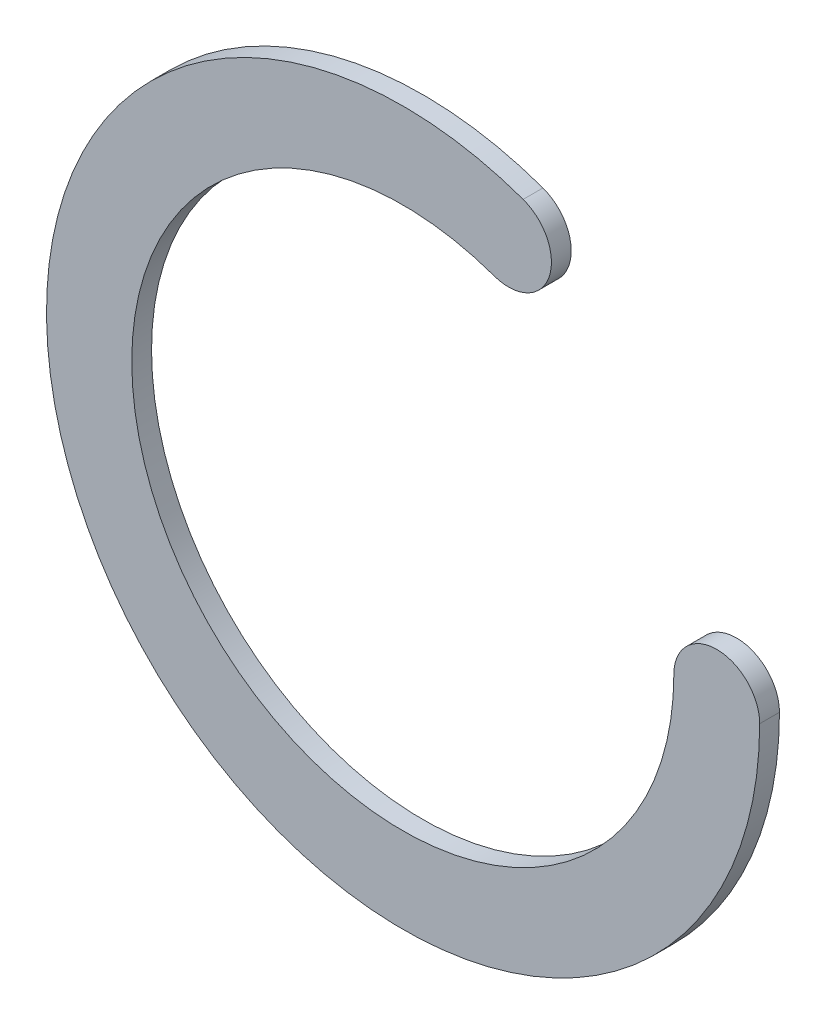
ISO-10303-21;
HEADER;
FILE_DESCRIPTION(('STEP AP214'),'2;1');
FILE_NAME('part.step','',(''),(''),'','','');
FILE_SCHEMA(('AUTOMOTIVE_DESIGN { 1 0 10303 214 1 1 1 1 }'));
ENDSEC;
DATA;
#1=APPLICATION_CONTEXT('core data for automotive mechanical design processes');
#2=APPLICATION_PROTOCOL_DEFINITION('international standard','automotive_design',2000,#1);
#3=PRODUCT_CONTEXT('',#1,'mechanical');
#4=PRODUCT('Part','Part','',(#3));
#5=PRODUCT_RELATED_PRODUCT_CATEGORY('part','',(#4));
#6=PRODUCT_DEFINITION_FORMATION('','',#4);
#7=PRODUCT_DEFINITION_CONTEXT('part definition',#1,'design');
#8=PRODUCT_DEFINITION('design','',#6,#7);
#9=PRODUCT_DEFINITION_SHAPE('','',#8);
#10=(LENGTH_UNIT() NAMED_UNIT(*) SI_UNIT(.MILLI.,.METRE.));
#11=(NAMED_UNIT(*) PLANE_ANGLE_UNIT() SI_UNIT($,.RADIAN.));
#12=(NAMED_UNIT(*) SI_UNIT($,.STERADIAN.) SOLID_ANGLE_UNIT());
#13=UNCERTAINTY_MEASURE_WITH_UNIT(LENGTH_MEASURE(1.E-05),#10,'distance_accuracy_value','');
#14=(GEOMETRIC_REPRESENTATION_CONTEXT(3) GLOBAL_UNCERTAINTY_ASSIGNED_CONTEXT((#13)) GLOBAL_UNIT_ASSIGNED_CONTEXT((#10,
#11,#12)) REPRESENTATION_CONTEXT('',''));
#15=CARTESIAN_POINT('',(0.,0.,0.));
#16=DIRECTION('',(0.,0.,1.));
#17=DIRECTION('',(1.,0.,0.));
#18=AXIS2_PLACEMENT_3D('',#15,#16,#17);
#19=CARTESIAN_POINT('',(0.,0.,0.));
#20=DIRECTION('',(0.,0.,1.));
#21=DIRECTION('',(1.,0.,0.));
#22=AXIS2_PLACEMENT_3D('',#19,#20,#21);
#23=PLANE('',#22);
#24=CARTESIAN_POINT('',(0.267,0.747,0.));
#25=DIRECTION('',(0.,0.,1.));
#26=DIRECTION('',(1.,0.,0.));
#27=AXIS2_PLACEMENT_3D('',#24,#25,#26);
#28=CIRCLE('',#27,0.1085034561662);
#29=CARTESIAN_POINT('',(0.229999999999992,0.644999999999977,0.));
#30=VERTEX_POINT('',#29);
#31=CARTESIAN_POINT('',(0.304000000000009,0.849000000000025,0.));
#32=VERTEX_POINT('',#31);
#33=EDGE_CURVE('E64',#30,#32,#28,.T.);
#34=ORIENTED_EDGE('',*,*,#33,.F.);
#35=CARTESIAN_POINT('',(-0.0002747590868853,-0.0004263804411362,0.));
#36=DIRECTION('',(0.,0.,1.));
#37=DIRECTION('',(1.,0.,0.));
#38=AXIS2_PLACEMENT_3D('',#35,#36,#37);
#39=CIRCLE('',#38,0.6852748917346);
#40=CARTESIAN_POINT('',(0.685,0.,0.));
#41=VERTEX_POINT('',#40);
#42=EDGE_CURVE('E62',#30,#41,#39,.T.);
#43=ORIENTED_EDGE('',*,*,#42,.T.);
#44=CARTESIAN_POINT('',(0.7935,0.,0.));
#45=DIRECTION('',(0.,0.,1.));
#46=DIRECTION('',(1.,0.,0.));
#47=AXIS2_PLACEMENT_3D('',#44,#45,#46);
#48=CIRCLE('',#47,0.1085);
#49=CARTESIAN_POINT('',(0.902,0.,0.));
#50=VERTEX_POINT('',#49);
#51=EDGE_CURVE('E20',#50,#41,#48,.T.);
#52=ORIENTED_EDGE('',*,*,#51,.F.);
#53=CARTESIAN_POINT('',(0.0004406659460998,8.247142022094E-05,0.));
#54=DIRECTION('',(0.,0.,1.));
#55=DIRECTION('',(1.,0.,0.));
#56=AXIS2_PLACEMENT_3D('',#53,#54,#55);
#57=CIRCLE('',#56,0.901559337826);
#58=EDGE_CURVE('E71',#32,#50,#57,.T.);
#59=ORIENTED_EDGE('',*,*,#58,.F.);
#60=EDGE_LOOP('',(#34,#43,#52,#59));
#61=FACE_BOUND('',#60,.T.);
#62=ADVANCED_FACE('F17',(#61),#23,.F.);
#63=CARTESIAN_POINT('',(-0.0002747590868853,-0.0004263804411362,0.));
#64=DIRECTION('',(0.,0.,1.));
#65=DIRECTION('',(1.,0.,0.));
#66=AXIS2_PLACEMENT_3D('',#63,#64,#65);
#67=CYLINDRICAL_SURFACE('',#66,0.6852748917346);
#68=CARTESIAN_POINT('',(-0.0002747590868853,-0.0004263804411362,0.05));
#69=DIRECTION('',(0.,0.,1.));
#70=DIRECTION('',(1.,0.,0.));
#71=AXIS2_PLACEMENT_3D('',#68,#69,#70);
#72=CIRCLE('',#71,0.6852748917346);
#73=CARTESIAN_POINT('',(0.684999999999999,0.,0.05));
#74=VERTEX_POINT('',#73);
#75=CARTESIAN_POINT('',(0.229999999999983,0.644999999999955,0.05));
#76=VERTEX_POINT('',#75);
#77=EDGE_CURVE('E70',#74,#76,#72,.F.);
#78=ORIENTED_EDGE('',*,*,#77,.F.);
#79=DIRECTION('',(0.,0.,1.));
#80=VECTOR('',#79,1.);
#81=CARTESIAN_POINT('',(0.685,0.,0.));
#82=LINE('',#81,#80);
#83=EDGE_CURVE('E61',#41,#74,#82,.T.);
#84=ORIENTED_EDGE('',*,*,#83,.F.);
#85=ORIENTED_EDGE('',*,*,#42,.F.);
#86=DIRECTION('',(0.,0.,1.));
#87=VECTOR('',#86,1.);
#88=CARTESIAN_POINT('',(0.229999999999983,0.644999999999955,0.));
#89=LINE('',#88,#87);
#90=EDGE_CURVE('E67',#76,#30,#89,.F.);
#91=ORIENTED_EDGE('',*,*,#90,.F.);
#92=EDGE_LOOP('',(#78,#84,#85,#91));
#93=FACE_BOUND('',#92,.T.);
#94=ADVANCED_FACE('F68',(#93),#67,.F.);
#95=CARTESIAN_POINT('',(0.267,0.747,0.));
#96=DIRECTION('',(0.,0.,1.));
#97=DIRECTION('',(1.,0.,0.));
#98=AXIS2_PLACEMENT_3D('',#95,#96,#97);
#99=CYLINDRICAL_SURFACE('',#98,0.1085034561662);
#100=ORIENTED_EDGE('',*,*,#90,.T.);
#101=ORIENTED_EDGE('',*,*,#33,.T.);
#102=DIRECTION('',(0.,0.,1.));
#103=VECTOR('',#102,1.);
#104=CARTESIAN_POINT('',(0.304000000000002,0.849000000000004,0.));
#105=LINE('',#104,#103);
#106=CARTESIAN_POINT('',(0.304000000000002,0.849000000000004,0.05));
#107=VERTEX_POINT('',#106);
#108=EDGE_CURVE('E74',#107,#32,#105,.F.);
#109=ORIENTED_EDGE('',*,*,#108,.F.);
#110=CARTESIAN_POINT('',(0.267,0.747,0.05));
#111=DIRECTION('',(0.,0.,1.));
#112=DIRECTION('',(1.,0.,0.));
#113=AXIS2_PLACEMENT_3D('',#110,#111,#112);
#114=CIRCLE('',#113,0.1085034561662);
#115=EDGE_CURVE('E82',#76,#107,#114,.T.);
#116=ORIENTED_EDGE('',*,*,#115,.F.);
#117=EDGE_LOOP('',(#100,#101,#109,#116));
#118=FACE_BOUND('',#117,.T.);
#119=ADVANCED_FACE('F87',(#118),#99,.T.);
#120=CARTESIAN_POINT('',(0.0004406659460998,8.247142022094E-05,0.));
#121=DIRECTION('',(0.,0.,1.));
#122=DIRECTION('',(1.,0.,0.));
#123=AXIS2_PLACEMENT_3D('',#120,#121,#122);
#124=CYLINDRICAL_SURFACE('',#123,0.901559337826);
#125=ORIENTED_EDGE('',*,*,#108,.T.);
#126=ORIENTED_EDGE('',*,*,#58,.T.);
#127=DIRECTION('',(0.,0.,1.));
#128=VECTOR('',#127,1.);
#129=CARTESIAN_POINT('',(0.902,0.,0.));
#130=LINE('',#129,#128);
#131=CARTESIAN_POINT('',(0.902,0.,0.05));
#132=VERTEX_POINT('',#131);
#133=EDGE_CURVE('E35',#132,#50,#130,.F.);
#134=ORIENTED_EDGE('',*,*,#133,.F.);
#135=CARTESIAN_POINT('',(0.0004406659460998,8.247142022094E-05,0.05));
#136=DIRECTION('',(0.,0.,1.));
#137=DIRECTION('',(1.,0.,0.));
#138=AXIS2_PLACEMENT_3D('',#135,#136,#137);
#139=CIRCLE('',#138,0.901559337826);
#140=EDGE_CURVE('E26',#107,#132,#139,.T.);
#141=ORIENTED_EDGE('',*,*,#140,.F.);
#142=EDGE_LOOP('',(#125,#126,#134,#141));
#143=FACE_BOUND('',#142,.T.);
#144=ADVANCED_FACE('F89',(#143),#124,.T.);
#145=CARTESIAN_POINT('',(0.7935,0.,0.));
#146=DIRECTION('',(0.,0.,1.));
#147=DIRECTION('',(1.,0.,0.));
#148=AXIS2_PLACEMENT_3D('',#145,#146,#147);
#149=CYLINDRICAL_SURFACE('',#148,0.1085);
#150=ORIENTED_EDGE('',*,*,#133,.T.);
#151=ORIENTED_EDGE('',*,*,#51,.T.);
#152=ORIENTED_EDGE('',*,*,#83,.T.);
#153=CARTESIAN_POINT('',(0.7935,0.,0.05));
#154=DIRECTION('',(0.,0.,1.));
#155=DIRECTION('',(1.,0.,0.));
#156=AXIS2_PLACEMENT_3D('',#153,#154,#155);
#157=CIRCLE('',#156,0.1085);
#158=EDGE_CURVE('E11',#132,#74,#157,.T.);
#159=ORIENTED_EDGE('',*,*,#158,.F.);
#160=EDGE_LOOP('',(#150,#151,#152,#159));
#161=FACE_BOUND('',#160,.T.);
#162=ADVANCED_FACE('F59',(#161),#149,.T.);
#163=CARTESIAN_POINT('',(0.,0.,0.05));
#164=DIRECTION('',(0.,0.,1.));
#165=DIRECTION('',(1.,0.,0.));
#166=AXIS2_PLACEMENT_3D('',#163,#164,#165);
#167=PLANE('',#166);
#168=ORIENTED_EDGE('',*,*,#140,.T.);
#169=ORIENTED_EDGE('',*,*,#158,.T.);
#170=ORIENTED_EDGE('',*,*,#77,.T.);
#171=ORIENTED_EDGE('',*,*,#115,.T.);
#172=EDGE_LOOP('',(#168,#169,#170,#171));
#173=FACE_BOUND('',#172,.T.);
#174=ADVANCED_FACE('F91',(#173),#167,.T.);
#175=CLOSED_SHELL('',(#62,#94,#119,#144,#162,#174));
#176=MANIFOLD_SOLID_BREP('B1',#175);
#177=ADVANCED_BREP_SHAPE_REPRESENTATION('',(#18,#176),#14);
#178=SHAPE_DEFINITION_REPRESENTATION(#9,#177);
ENDSEC;
END-ISO-10303-21;
